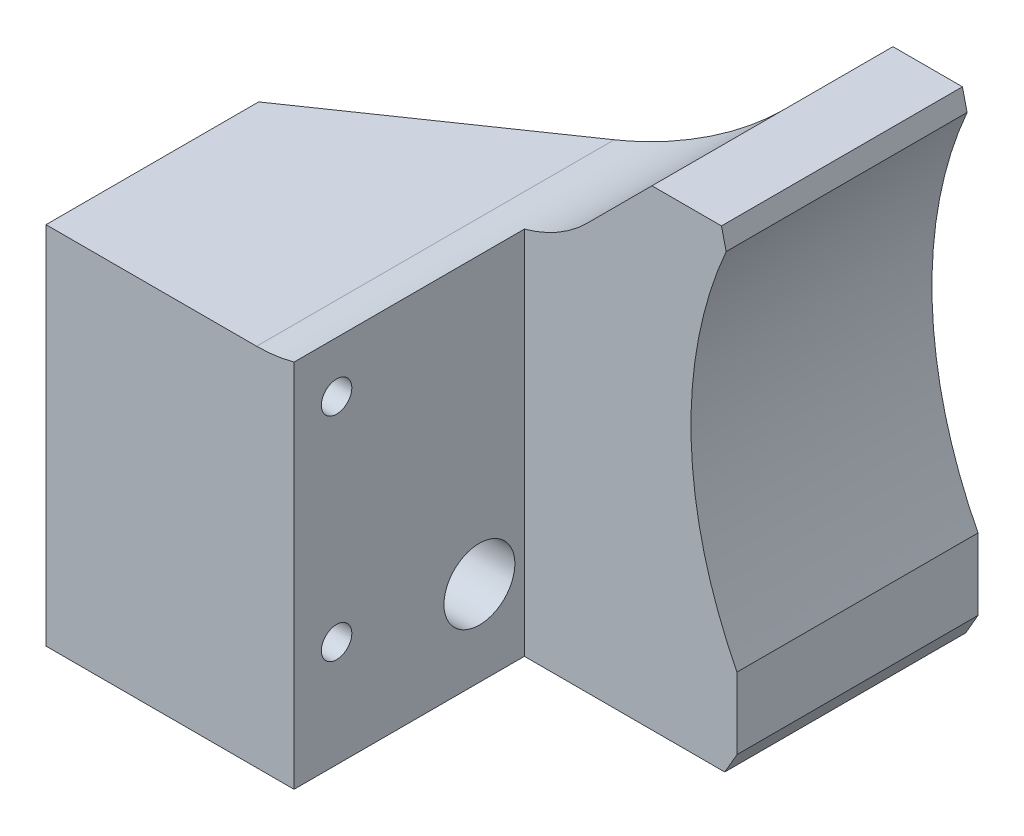
ISO-10303-21;
HEADER;
FILE_DESCRIPTION(('STEP AP214'),'2;1');
FILE_NAME('part.step','',(''),(''),'','','');
FILE_SCHEMA(('AUTOMOTIVE_DESIGN { 1 0 10303 214 1 1 1 1 }'));
ENDSEC;
DATA;
#1=APPLICATION_CONTEXT('core data for automotive mechanical design processes');
#2=APPLICATION_PROTOCOL_DEFINITION('international standard','automotive_design',2000,#1);
#3=PRODUCT_CONTEXT('',#1,'mechanical');
#4=PRODUCT('Part','Part','',(#3));
#5=PRODUCT_RELATED_PRODUCT_CATEGORY('part','',(#4));
#6=PRODUCT_DEFINITION_FORMATION('','',#4);
#7=PRODUCT_DEFINITION_CONTEXT('part definition',#1,'design');
#8=PRODUCT_DEFINITION('design','',#6,#7);
#9=PRODUCT_DEFINITION_SHAPE('','',#8);
#10=(LENGTH_UNIT() NAMED_UNIT(*) SI_UNIT(.MILLI.,.METRE.));
#11=(NAMED_UNIT(*) PLANE_ANGLE_UNIT() SI_UNIT($,.RADIAN.));
#12=(NAMED_UNIT(*) SI_UNIT($,.STERADIAN.) SOLID_ANGLE_UNIT());
#13=UNCERTAINTY_MEASURE_WITH_UNIT(LENGTH_MEASURE(1.E-05),#10,'distance_accuracy_value','');
#14=(GEOMETRIC_REPRESENTATION_CONTEXT(3) GLOBAL_UNCERTAINTY_ASSIGNED_CONTEXT((#13)) GLOBAL_UNIT_ASSIGNED_CONTEXT((#10,
#11,#12)) REPRESENTATION_CONTEXT('',''));
#15=CARTESIAN_POINT('',(0.,0.,0.));
#16=DIRECTION('',(0.,0.,1.));
#17=DIRECTION('',(1.,0.,0.));
#18=AXIS2_PLACEMENT_3D('',#15,#16,#17);
#19=CARTESIAN_POINT('',(65.,45.,-6.));
#20=DIRECTION('',(-1.,0.,0.));
#21=DIRECTION('',(0.,0.,-1.));
#22=AXIS2_PLACEMENT_3D('',#19,#20,#21);
#23=CYLINDRICAL_SURFACE('',#22,2.15);
#24=CARTESIAN_POINT('',(35.,45.,-6.));
#25=DIRECTION('',(1.,0.,0.));
#26=DIRECTION('',(0.,0.,-1.));
#27=AXIS2_PLACEMENT_3D('',#24,#25,#26);
#28=CIRCLE('',#27,2.15);
#29=CARTESIAN_POINT('',(35.,45.,-8.15));
#30=VERTEX_POINT('',#29);
#31=EDGE_CURVE('E170',#30,#30,#28,.T.);
#32=ORIENTED_EDGE('',*,*,#31,.T.);
#33=EDGE_LOOP('',(#32));
#34=FACE_BOUND('',#33,.T.);
#35=CARTESIAN_POINT('',(25.,45.,-6.));
#36=DIRECTION('',(1.,0.,0.));
#37=DIRECTION('',(0.,0.,-1.));
#38=AXIS2_PLACEMENT_3D('',#35,#36,#37);
#39=CIRCLE('',#38,2.15);
#40=CARTESIAN_POINT('',(25.,45.,-8.15));
#41=VERTEX_POINT('',#40);
#42=EDGE_CURVE('E240',#41,#41,#39,.F.);
#43=ORIENTED_EDGE('',*,*,#42,.T.);
#44=EDGE_LOOP('',(#43));
#45=FACE_BOUND('',#44,.T.);
#46=ADVANCED_FACE('F43',(#34,#45),#23,.F.);
#47=CARTESIAN_POINT('',(65.,15.,-6.));
#48=DIRECTION('',(-1.,0.,0.));
#49=DIRECTION('',(0.,0.,-1.));
#50=AXIS2_PLACEMENT_3D('',#47,#48,#49);
#51=CYLINDRICAL_SURFACE('',#50,2.15);
#52=CARTESIAN_POINT('',(35.,15.,-6.));
#53=DIRECTION('',(1.,0.,0.));
#54=DIRECTION('',(0.,0.,-1.));
#55=AXIS2_PLACEMENT_3D('',#52,#53,#54);
#56=CIRCLE('',#55,2.15);
#57=CARTESIAN_POINT('',(35.,15.,-8.15));
#58=VERTEX_POINT('',#57);
#59=EDGE_CURVE('E166',#58,#58,#56,.T.);
#60=ORIENTED_EDGE('',*,*,#59,.T.);
#61=EDGE_LOOP('',(#60));
#62=FACE_BOUND('',#61,.T.);
#63=CARTESIAN_POINT('',(25.,15.,-6.));
#64=DIRECTION('',(1.,0.,0.));
#65=DIRECTION('',(0.,0.,-1.));
#66=AXIS2_PLACEMENT_3D('',#63,#64,#65);
#67=CIRCLE('',#66,2.15);
#68=CARTESIAN_POINT('',(25.,15.,-8.15));
#69=VERTEX_POINT('',#68);
#70=EDGE_CURVE('E242',#69,#69,#67,.F.);
#71=ORIENTED_EDGE('',*,*,#70,.T.);
#72=EDGE_LOOP('',(#71));
#73=FACE_BOUND('',#72,.T.);
#74=ADVANCED_FACE('F318',(#62,#73),#51,.F.);
#75=CARTESIAN_POINT('',(0.,51.5,0.));
#76=DIRECTION('',(0.,-1.,0.));
#77=DIRECTION('',(0.,0.,1.));
#78=AXIS2_PLACEMENT_3D('',#75,#76,#77);
#79=PLANE('',#78);
#80=DIRECTION('',(0.823588256020125,0.,-0.567188138579897));
#81=VECTOR('',#80,1.);
#82=CARTESIAN_POINT('',(53.,51.5,-66.5));
#83=LINE('',#82,#81);
#84=CARTESIAN_POINT('',(0.,51.5,-30.));
#85=VERTEX_POINT('',#84);
#86=CARTESIAN_POINT('',(29.7157287525381,51.5,-50.4646056503328));
#87=VERTEX_POINT('',#86);
#88=EDGE_CURVE('E194',#85,#87,#83,.T.);
#89=ORIENTED_EDGE('',*,*,#88,.F.);
#90=DIRECTION('',(0.,0.,-1.));
#91=VECTOR('',#90,1.);
#92=CARTESIAN_POINT('',(0.,51.5,-30.));
#93=LINE('',#92,#91);
#94=CARTESIAN_POINT('',(0.,51.5,0.));
#95=VERTEX_POINT('',#94);
#96=EDGE_CURVE('E191',#95,#85,#93,.T.);
#97=ORIENTED_EDGE('',*,*,#96,.F.);
#98=DIRECTION('',(-1.,0.,0.));
#99=VECTOR('',#98,1.);
#100=CARTESIAN_POINT('',(0.,51.5,0.));
#101=LINE('',#100,#99);
#102=CARTESIAN_POINT('',(29.7157287525381,51.5,0.));
#103=VERTEX_POINT('',#102);
#104=EDGE_CURVE('E198',#103,#95,#101,.T.);
#105=ORIENTED_EDGE('',*,*,#104,.F.);
#106=DIRECTION('',(0.,0.,-1.));
#107=VECTOR('',#106,1.);
#108=CARTESIAN_POINT('',(29.7157287525381,51.5,-32.5));
#109=LINE('',#108,#107);
#110=EDGE_CURVE('E238',#87,#103,#109,.F.);
#111=ORIENTED_EDGE('',*,*,#110,.F.);
#112=EDGE_LOOP('',(#89,#97,#105,#111));
#113=FACE_BOUND('',#112,.T.);
#114=ADVANCED_FACE('F297',(#113),#79,.F.);
#115=CARTESIAN_POINT('',(0.,51.5,-30.));
#116=DIRECTION('',(1.,0.,0.));
#117=DIRECTION('',(0.,0.,1.));
#118=AXIS2_PLACEMENT_3D('',#115,#116,#117);
#119=PLANE('',#118);
#120=CARTESIAN_POINT('',(0.,45.,-6.));
#121=DIRECTION('',(1.,0.,0.));
#122=DIRECTION('',(0.,0.,-1.));
#123=AXIS2_PLACEMENT_3D('',#120,#121,#122);
#124=CIRCLE('',#123,4.5);
#125=CARTESIAN_POINT('',(0.,45.,-10.5));
#126=VERTEX_POINT('',#125);
#127=EDGE_CURVE('E511',#126,#126,#124,.T.);
#128=ORIENTED_EDGE('',*,*,#127,.T.);
#129=EDGE_LOOP('',(#128));
#130=FACE_BOUND('',#129,.T.);
#131=CARTESIAN_POINT('',(0.,15.,-6.));
#132=DIRECTION('',(1.,0.,0.));
#133=DIRECTION('',(0.,0.,-1.));
#134=AXIS2_PLACEMENT_3D('',#131,#132,#133);
#135=CIRCLE('',#134,4.5);
#136=CARTESIAN_POINT('',(0.,15.,-10.5));
#137=VERTEX_POINT('',#136);
#138=EDGE_CURVE('E515',#137,#137,#135,.T.);
#139=ORIENTED_EDGE('',*,*,#138,.T.);
#140=EDGE_LOOP('',(#139));
#141=FACE_BOUND('',#140,.T.);
#142=DIRECTION('',(0.,-1.,0.));
#143=VECTOR('',#142,1.);
#144=CARTESIAN_POINT('',(0.,51.5,-30.));
#145=LINE('',#144,#143);
#146=CARTESIAN_POINT('',(0.,8.80978057181012,-30.));
#147=VERTEX_POINT('',#146);
#148=CARTESIAN_POINT('',(0.,0.,-30.));
#149=VERTEX_POINT('',#148);
#150=EDGE_CURVE('E228',#147,#149,#145,.T.);
#151=ORIENTED_EDGE('',*,*,#150,.T.);
#152=DIRECTION('',(0.,0.,-1.));
#153=VECTOR('',#152,1.);
#154=CARTESIAN_POINT('',(0.,0.,-30.));
#155=LINE('',#154,#153);
#156=CARTESIAN_POINT('',(0.,0.,0.));
#157=VERTEX_POINT('',#156);
#158=EDGE_CURVE('E190',#157,#149,#155,.T.);
#159=ORIENTED_EDGE('',*,*,#158,.F.);
#160=DIRECTION('',(0.,-1.,0.));
#161=VECTOR('',#160,1.);
#162=CARTESIAN_POINT('',(0.,51.5,0.));
#163=LINE('',#162,#161);
#164=EDGE_CURVE('E201',#95,#157,#163,.T.);
#165=ORIENTED_EDGE('',*,*,#164,.F.);
#166=ORIENTED_EDGE('',*,*,#96,.T.);
#167=CARTESIAN_POINT('',(0.,15.1902194281899,-30.));
#168=VERTEX_POINT('',#167);
#169=EDGE_CURVE('E229',#85,#168,#145,.T.);
#170=ORIENTED_EDGE('',*,*,#169,.T.);
#171=CARTESIAN_POINT('',(0.,12.,-26.15));
#172=DIRECTION('',(-1.,0.,0.));
#173=DIRECTION('',(0.,0.,1.));
#174=AXIS2_PLACEMENT_3D('',#171,#172,#173);
#175=CIRCLE('',#174,5.);
#176=EDGE_CURVE('E183',#147,#168,#175,.T.);
#177=ORIENTED_EDGE('',*,*,#176,.F.);
#178=EDGE_LOOP('',(#151,#159,#165,#166,#170,#177));
#179=FACE_BOUND('',#178,.T.);
#180=ADVANCED_FACE('F340',(#130,#141,#179),#119,.F.);
#181=CARTESIAN_POINT('',(53.,51.5,-66.5));
#182=DIRECTION('',(0.567188138579897,0.,0.823588256020125));
#183=DIRECTION('',(-0.823588256020125,0.,0.567188138579897));
#184=AXIS2_PLACEMENT_3D('',#181,#182,#183);
#185=PLANE('',#184);
#186=ORIENTED_EDGE('',*,*,#169,.F.);
#187=ORIENTED_EDGE('',*,*,#88,.T.);
#188=CARTESIAN_POINT('',(29.7157287525381,71.5,-50.4646056503328));
#189=DIRECTION('',(-0.567188138579897,0.,-0.823588256020125));
#190=DIRECTION('',(-0.823588256020125,0.,0.567188138579897));
#191=AXIS2_PLACEMENT_3D('',#188,#189,#190);
#192=ELLIPSE('',#191,24.2839791046162,20.);
#193=CARTESIAN_POINT('',(43.8578643762691,57.3578643762691,-60.204000938374));
#194=VERTEX_POINT('',#193);
#195=EDGE_CURVE('E259',#194,#87,#192,.T.);
#196=ORIENTED_EDGE('',*,*,#195,.F.);
#197=DIRECTION('',(0.635734318570653,0.63573431857066,-0.437817030713751));
#198=VECTOR('',#197,1.);
#199=CARTESIAN_POINT('',(46.9376281428725,60.4376281428725,-62.3249703248084));
#200=LINE('',#199,#198);
#201=CARTESIAN_POINT('',(53.,66.5000000000001,-66.5));
#202=VERTEX_POINT('',#201);
#203=EDGE_CURVE('E232',#202,#194,#200,.F.);
#204=ORIENTED_EDGE('',*,*,#203,.F.);
#205=DIRECTION('',(0.,-1.,0.));
#206=VECTOR('',#205,1.);
#207=CARTESIAN_POINT('',(53.,51.5,-66.5));
#208=LINE('',#207,#206);
#209=CARTESIAN_POINT('',(53.,0.,-66.5));
#210=VERTEX_POINT('',#209);
#211=EDGE_CURVE('E159',#202,#210,#208,.T.);
#212=ORIENTED_EDGE('',*,*,#211,.T.);
#213=DIRECTION('',(0.823588256020125,0.,-0.567188138579897));
#214=VECTOR('',#213,1.);
#215=CARTESIAN_POINT('',(53.,0.,-66.5));
#216=LINE('',#215,#214);
#217=EDGE_CURVE('E204',#149,#210,#216,.T.);
#218=ORIENTED_EDGE('',*,*,#217,.F.);
#219=ORIENTED_EDGE('',*,*,#150,.F.);
#220=CARTESIAN_POINT('',(-5.59041095890409,12.,-26.15));
#221=DIRECTION('',(-0.567188138579897,0.,-0.823588256020125));
#222=DIRECTION('',(0.823588256020125,0.,-0.567188138579897));
#223=AXIS2_PLACEMENT_3D('',#220,#221,#222);
#224=ELLIPSE('',#223,8.81541707222368,5.);
#225=EDGE_CURVE('E186',#168,#147,#224,.T.);
#226=ORIENTED_EDGE('',*,*,#225,.F.);
#227=EDGE_LOOP('',(#186,#187,#196,#204,#212,#218,#219,#226));
#228=FACE_BOUND('',#227,.T.);
#229=ADVANCED_FACE('F289',(#228),#185,.F.);
#230=CARTESIAN_POINT('',(65.,51.5,-66.5));
#231=DIRECTION('',(0.,0.,1.));
#232=DIRECTION('',(-1.,0.,0.));
#233=AXIS2_PLACEMENT_3D('',#230,#231,#232);
#234=PLANE('',#233);
#235=CARTESIAN_POINT('',(117.5,40.,-66.5));
#236=DIRECTION('',(0.,0.,1.));
#237=DIRECTION('',(1.,0.,0.));
#238=AXIS2_PLACEMENT_3D('',#235,#236,#237);
#239=CIRCLE('',#238,59.);
#240=CARTESIAN_POINT('',(63.4678246627246,63.696498229104,-66.5));
#241=VERTEX_POINT('',#240);
#242=CARTESIAN_POINT('',(65.,13.0788187480564,-66.5));
#243=VERTEX_POINT('',#242);
#244=EDGE_CURVE('E143',#241,#243,#239,.T.);
#245=ORIENTED_EDGE('',*,*,#244,.T.);
#246=DIRECTION('',(0.,-1.,0.));
#247=VECTOR('',#246,1.);
#248=CARTESIAN_POINT('',(65.,51.5,-66.5));
#249=LINE('',#248,#247);
#250=CARTESIAN_POINT('',(65.,3.00000000000003,-66.5));
#251=VERTEX_POINT('',#250);
#252=EDGE_CURVE('E152',#243,#251,#249,.T.);
#253=ORIENTED_EDGE('',*,*,#252,.T.);
#254=DIRECTION('',(0.499999999999992,0.866025403784443,0.));
#255=VECTOR('',#254,1.);
#256=CARTESIAN_POINT('',(65.,3.00000000000002,-66.5));
#257=LINE('',#256,#255);
#258=CARTESIAN_POINT('',(63.2679491924312,0.,-66.5));
#259=VERTEX_POINT('',#258);
#260=EDGE_CURVE('E267',#259,#251,#257,.T.);
#261=ORIENTED_EDGE('',*,*,#260,.F.);
#262=DIRECTION('',(1.,0.,0.));
#263=VECTOR('',#262,1.);
#264=CARTESIAN_POINT('',(65.,0.,-66.5));
#265=LINE('',#264,#263);
#266=EDGE_CURVE('E207',#210,#259,#265,.T.);
#267=ORIENTED_EDGE('',*,*,#266,.F.);
#268=ORIENTED_EDGE('',*,*,#211,.F.);
#269=DIRECTION('',(1.,0.,0.));
#270=VECTOR('',#269,1.);
#271=CARTESIAN_POINT('',(65.,66.5,-66.5));
#272=LINE('',#271,#270);
#273=CARTESIAN_POINT('',(62.8045533800256,66.5,-66.5));
#274=VERTEX_POINT('',#273);
#275=EDGE_CURVE('E180',#202,#274,#272,.T.);
#276=ORIENTED_EDGE('',*,*,#275,.T.);
#277=DIRECTION('',(0.230231050966929,-0.97313599418101,0.));
#278=VECTOR('',#277,1.);
#279=CARTESIAN_POINT('',(63.4678246627246,63.696498229104,-66.5));
#280=LINE('',#279,#278);
#281=EDGE_CURVE('E165',#241,#274,#280,.F.);
#282=ORIENTED_EDGE('',*,*,#281,.F.);
#283=EDGE_LOOP('',(#245,#253,#261,#267,#268,#276,#282));
#284=FACE_BOUND('',#283,.T.);
#285=ADVANCED_FACE('F163',(#284),#234,.F.);
#286=CARTESIAN_POINT('',(65.,51.5,-32.5));
#287=DIRECTION('',(-1.,0.,0.));
#288=DIRECTION('',(0.,0.,-1.));
#289=AXIS2_PLACEMENT_3D('',#286,#287,#288);
#290=PLANE('',#289);
#291=ORIENTED_EDGE('',*,*,#252,.F.);
#292=DIRECTION('',(0.,0.,-1.));
#293=VECTOR('',#292,1.);
#294=CARTESIAN_POINT('',(65.,13.0788187480565,0.));
#295=LINE('',#294,#293);
#296=CARTESIAN_POINT('',(65.,13.0788187480564,-32.5));
#297=VERTEX_POINT('',#296);
#298=EDGE_CURVE('E139',#297,#243,#295,.T.);
#299=ORIENTED_EDGE('',*,*,#298,.F.);
#300=DIRECTION('',(0.,-1.,0.));
#301=VECTOR('',#300,1.);
#302=CARTESIAN_POINT('',(65.,51.5,-32.5));
#303=LINE('',#302,#301);
#304=CARTESIAN_POINT('',(65.,3.00000000000003,-32.5));
#305=VERTEX_POINT('',#304);
#306=EDGE_CURVE('E160',#297,#305,#303,.T.);
#307=ORIENTED_EDGE('',*,*,#306,.T.);
#308=DIRECTION('',(0.,0.,1.));
#309=VECTOR('',#308,1.);
#310=CARTESIAN_POINT('',(65.,3.00000000000003,-32.5));
#311=LINE('',#310,#309);
#312=EDGE_CURVE('E155',#251,#305,#311,.T.);
#313=ORIENTED_EDGE('',*,*,#312,.F.);
#314=EDGE_LOOP('',(#291,#299,#307,#313));
#315=FACE_BOUND('',#314,.T.);
#316=ADVANCED_FACE('F153',(#315),#290,.F.);
#317=CARTESIAN_POINT('',(35.,51.5,-32.5));
#318=DIRECTION('',(0.,0.,-1.));
#319=DIRECTION('',(1.,0.,0.));
#320=AXIS2_PLACEMENT_3D('',#317,#318,#319);
#321=PLANE('',#320);
#322=DIRECTION('',(-1.,0.,0.));
#323=VECTOR('',#322,1.);
#324=CARTESIAN_POINT('',(65.,66.5,-32.5));
#325=LINE('',#324,#323);
#326=CARTESIAN_POINT('',(62.8045533800256,66.5,-32.5));
#327=VERTEX_POINT('',#326);
#328=CARTESIAN_POINT('',(53.,66.5,-32.5));
#329=VERTEX_POINT('',#328);
#330=EDGE_CURVE('E149',#327,#329,#325,.T.);
#331=ORIENTED_EDGE('',*,*,#330,.T.);
#332=DIRECTION('',(-0.707106781186543,-0.707106781186552,0.));
#333=VECTOR('',#332,1.);
#334=CARTESIAN_POINT('',(36.5,50.,-32.5));
#335=LINE('',#334,#333);
#336=CARTESIAN_POINT('',(43.8578643762691,57.3578643762691,-32.5));
#337=VERTEX_POINT('',#336);
#338=EDGE_CURVE('E235',#337,#329,#335,.F.);
#339=ORIENTED_EDGE('',*,*,#338,.F.);
#340=CARTESIAN_POINT('',(29.7157287525381,71.5,-32.5));
#341=DIRECTION('',(0.,0.,1.));
#342=DIRECTION('',(1.,0.,0.));
#343=AXIS2_PLACEMENT_3D('',#340,#341,#342);
#344=CIRCLE('',#343,20.);
#345=CARTESIAN_POINT('',(35.,52.2107159960965,-32.5));
#346=VERTEX_POINT('',#345);
#347=EDGE_CURVE('E256',#346,#337,#344,.T.);
#348=ORIENTED_EDGE('',*,*,#347,.F.);
#349=DIRECTION('',(0.,-1.,0.));
#350=VECTOR('',#349,1.);
#351=CARTESIAN_POINT('',(35.,51.5,-32.5));
#352=LINE('',#351,#350);
#353=CARTESIAN_POINT('',(35.,0.,-32.5));
#354=VERTEX_POINT('',#353);
#355=EDGE_CURVE('E222',#346,#354,#352,.T.);
#356=ORIENTED_EDGE('',*,*,#355,.T.);
#357=DIRECTION('',(-1.,0.,0.));
#358=VECTOR('',#357,1.);
#359=CARTESIAN_POINT('',(35.,0.,-32.5));
#360=LINE('',#359,#358);
#361=CARTESIAN_POINT('',(63.2679491924311,0.,-32.5));
#362=VERTEX_POINT('',#361);
#363=EDGE_CURVE('E210',#362,#354,#360,.T.);
#364=ORIENTED_EDGE('',*,*,#363,.F.);
#365=DIRECTION('',(-0.499999999999992,-0.866025403784443,0.));
#366=VECTOR('',#365,1.);
#367=CARTESIAN_POINT('',(65.,3.00000000000003,-32.5));
#368=LINE('',#367,#366);
#369=EDGE_CURVE('E262',#305,#362,#368,.T.);
#370=ORIENTED_EDGE('',*,*,#369,.F.);
#371=ORIENTED_EDGE('',*,*,#306,.F.);
#372=CARTESIAN_POINT('',(117.5,40.,-32.5));
#373=DIRECTION('',(0.,0.,1.));
#374=DIRECTION('',(1.,0.,0.));
#375=AXIS2_PLACEMENT_3D('',#372,#373,#374);
#376=CIRCLE('',#375,59.);
#377=CARTESIAN_POINT('',(63.4678246627246,63.696498229104,-32.5));
#378=VERTEX_POINT('',#377);
#379=EDGE_CURVE('E145',#378,#297,#376,.T.);
#380=ORIENTED_EDGE('',*,*,#379,.F.);
#381=DIRECTION('',(-0.230231050966929,0.97313599418101,0.));
#382=VECTOR('',#381,1.);
#383=CARTESIAN_POINT('',(63.4678246627246,63.696498229104,-32.5));
#384=LINE('',#383,#382);
#385=EDGE_CURVE('E11',#327,#378,#384,.F.);
#386=ORIENTED_EDGE('',*,*,#385,.F.);
#387=EDGE_LOOP('',(#331,#339,#348,#356,#364,#370,#371,#380,#386));
#388=FACE_BOUND('',#387,.T.);
#389=ADVANCED_FACE('F279',(#388),#321,.F.);
#390=CARTESIAN_POINT('',(35.,51.5,0.));
#391=DIRECTION('',(-1.,0.,0.));
#392=DIRECTION('',(0.,0.,-1.));
#393=AXIS2_PLACEMENT_3D('',#390,#391,#392);
#394=PLANE('',#393);
#395=ORIENTED_EDGE('',*,*,#59,.F.);
#396=EDGE_LOOP('',(#395));
#397=FACE_BOUND('',#396,.T.);
#398=ORIENTED_EDGE('',*,*,#31,.F.);
#399=EDGE_LOOP('',(#398));
#400=FACE_BOUND('',#399,.T.);
#401=CARTESIAN_POINT('',(35.,12.,-26.15));
#402=DIRECTION('',(-1.,0.,0.));
#403=DIRECTION('',(0.,0.,1.));
#404=AXIS2_PLACEMENT_3D('',#401,#402,#403);
#405=CIRCLE('',#404,5.);
#406=CARTESIAN_POINT('',(35.,12.,-21.15));
#407=VERTEX_POINT('',#406);
#408=EDGE_CURVE('E182',#407,#407,#405,.T.);
#409=ORIENTED_EDGE('',*,*,#408,.T.);
#410=EDGE_LOOP('',(#409));
#411=FACE_BOUND('',#410,.T.);
#412=DIRECTION('',(0.,0.,1.));
#413=VECTOR('',#412,1.);
#414=CARTESIAN_POINT('',(35.,0.,0.));
#415=LINE('',#414,#413);
#416=CARTESIAN_POINT('',(35.,0.,0.));
#417=VERTEX_POINT('',#416);
#418=EDGE_CURVE('E213',#354,#417,#415,.T.);
#419=ORIENTED_EDGE('',*,*,#418,.F.);
#420=ORIENTED_EDGE('',*,*,#355,.F.);
#421=DIRECTION('',(0.,0.,1.));
#422=VECTOR('',#421,1.);
#423=CARTESIAN_POINT('',(35.,52.2107159960965,0.));
#424=LINE('',#423,#422);
#425=CARTESIAN_POINT('',(35.,52.2107159960965,0.));
#426=VERTEX_POINT('',#425);
#427=EDGE_CURVE('E254',#426,#346,#424,.F.);
#428=ORIENTED_EDGE('',*,*,#427,.F.);
#429=DIRECTION('',(0.,-1.,0.));
#430=VECTOR('',#429,1.);
#431=CARTESIAN_POINT('',(35.,51.5,0.));
#432=LINE('',#431,#430);
#433=EDGE_CURVE('E219',#426,#417,#432,.T.);
#434=ORIENTED_EDGE('',*,*,#433,.T.);
#435=EDGE_LOOP('',(#419,#420,#428,#434));
#436=FACE_BOUND('',#435,.T.);
#437=ADVANCED_FACE('F305',(#397,#400,#411,#436),#394,.F.);
#438=CARTESIAN_POINT('',(0.,51.5,0.));
#439=DIRECTION('',(0.,0.,-1.));
#440=DIRECTION('',(1.,0.,0.));
#441=AXIS2_PLACEMENT_3D('',#438,#439,#440);
#442=PLANE('',#441);
#443=DIRECTION('',(-1.,0.,0.));
#444=VECTOR('',#443,1.);
#445=CARTESIAN_POINT('',(0.,0.,0.));
#446=LINE('',#445,#444);
#447=EDGE_CURVE('E195',#417,#157,#446,.T.);
#448=ORIENTED_EDGE('',*,*,#447,.F.);
#449=ORIENTED_EDGE('',*,*,#433,.F.);
#450=CARTESIAN_POINT('',(29.7157287525381,71.5,0.));
#451=DIRECTION('',(0.,0.,1.));
#452=DIRECTION('',(1.,0.,0.));
#453=AXIS2_PLACEMENT_3D('',#450,#451,#452);
#454=CIRCLE('',#453,20.);
#455=EDGE_CURVE('E252',#103,#426,#454,.T.);
#456=ORIENTED_EDGE('',*,*,#455,.F.);
#457=ORIENTED_EDGE('',*,*,#104,.T.);
#458=ORIENTED_EDGE('',*,*,#164,.T.);
#459=EDGE_LOOP('',(#448,#449,#456,#457,#458));
#460=FACE_BOUND('',#459,.T.);
#461=ADVANCED_FACE('F300',(#460),#442,.F.);
#462=CARTESIAN_POINT('',(0.,0.,0.));
#463=DIRECTION('',(0.,-1.,0.));
#464=DIRECTION('',(0.,0.,1.));
#465=AXIS2_PLACEMENT_3D('',#462,#463,#464);
#466=PLANE('',#465);
#467=ORIENTED_EDGE('',*,*,#363,.T.);
#468=ORIENTED_EDGE('',*,*,#418,.T.);
#469=ORIENTED_EDGE('',*,*,#447,.T.);
#470=ORIENTED_EDGE('',*,*,#158,.T.);
#471=ORIENTED_EDGE('',*,*,#217,.T.);
#472=ORIENTED_EDGE('',*,*,#266,.T.);
#473=DIRECTION('',(0.,0.,-1.));
#474=VECTOR('',#473,1.);
#475=CARTESIAN_POINT('',(63.2679491924312,0.,-66.5));
#476=LINE('',#475,#474);
#477=EDGE_CURVE('E265',#362,#259,#476,.T.);
#478=ORIENTED_EDGE('',*,*,#477,.F.);
#479=EDGE_LOOP('',(#467,#468,#469,#470,#471,#472,#478));
#480=FACE_BOUND('',#479,.T.);
#481=ADVANCED_FACE('F284',(#480),#466,.T.);
#482=CARTESIAN_POINT('',(0.,12.,-26.15));
#483=DIRECTION('',(1.,0.,0.));
#484=DIRECTION('',(0.,0.,1.));
#485=AXIS2_PLACEMENT_3D('',#482,#483,#484);
#486=CYLINDRICAL_SURFACE('',#485,5.);
#487=ORIENTED_EDGE('',*,*,#408,.F.);
#488=EDGE_LOOP('',(#487));
#489=FACE_BOUND('',#488,.T.);
#490=ORIENTED_EDGE('',*,*,#176,.T.);
#491=ORIENTED_EDGE('',*,*,#225,.T.);
#492=EDGE_LOOP('',(#490,#491));
#493=FACE_BOUND('',#492,.T.);
#494=ADVANCED_FACE('F334',(#489,#493),#486,.F.);
#495=CARTESIAN_POINT('',(0.,66.5,0.));
#496=DIRECTION('',(0.,1.,0.));
#497=DIRECTION('',(0.,0.,-1.));
#498=AXIS2_PLACEMENT_3D('',#495,#496,#497);
#499=PLANE('',#498);
#500=ORIENTED_EDGE('',*,*,#275,.F.);
#501=DIRECTION('',(0.,0.,-1.));
#502=VECTOR('',#501,1.);
#503=CARTESIAN_POINT('',(53.,66.5,-66.5));
#504=LINE('',#503,#502);
#505=EDGE_CURVE('E178',#329,#202,#504,.T.);
#506=ORIENTED_EDGE('',*,*,#505,.F.);
#507=ORIENTED_EDGE('',*,*,#330,.F.);
#508=DIRECTION('',(0.,0.,1.));
#509=VECTOR('',#508,1.);
#510=CARTESIAN_POINT('',(62.8045533800256,66.5,-32.5));
#511=LINE('',#510,#509);
#512=EDGE_CURVE('E51',#274,#327,#511,.T.);
#513=ORIENTED_EDGE('',*,*,#512,.F.);
#514=EDGE_LOOP('',(#500,#506,#507,#513));
#515=FACE_BOUND('',#514,.T.);
#516=ADVANCED_FACE('F273',(#515),#499,.T.);
#517=CARTESIAN_POINT('',(53.,66.5000000000001,-66.5));
#518=DIRECTION('',(-0.707106781186552,0.707106781186543,0.));
#519=DIRECTION('',(0.,0.,1.));
#520=AXIS2_PLACEMENT_3D('',#517,#518,#519);
#521=PLANE('',#520);
#522=ORIENTED_EDGE('',*,*,#338,.T.);
#523=ORIENTED_EDGE('',*,*,#505,.T.);
#524=ORIENTED_EDGE('',*,*,#203,.T.);
#525=DIRECTION('',(0.,0.,1.));
#526=VECTOR('',#525,1.);
#527=CARTESIAN_POINT('',(43.8578643762691,57.3578643762691,-56.1698113207548));
#528=LINE('',#527,#526);
#529=EDGE_CURVE('E250',#337,#194,#528,.F.);
#530=ORIENTED_EDGE('',*,*,#529,.F.);
#531=EDGE_LOOP('',(#522,#523,#524,#530));
#532=FACE_BOUND('',#531,.T.);
#533=ADVANCED_FACE('F276',(#532),#521,.T.);
#534=CARTESIAN_POINT('',(117.5,40.,0.));
#535=DIRECTION('',(0.,0.,-1.));
#536=DIRECTION('',(1.,0.,0.));
#537=AXIS2_PLACEMENT_3D('',#534,#535,#536);
#538=CYLINDRICAL_SURFACE('',#537,59.);
#539=ORIENTED_EDGE('',*,*,#379,.T.);
#540=ORIENTED_EDGE('',*,*,#298,.T.);
#541=ORIENTED_EDGE('',*,*,#244,.F.);
#542=DIRECTION('',(0.,0.,-1.));
#543=VECTOR('',#542,1.);
#544=CARTESIAN_POINT('',(63.4678246627246,63.696498229104,0.));
#545=LINE('',#544,#543);
#546=EDGE_CURVE('E269',#378,#241,#545,.T.);
#547=ORIENTED_EDGE('',*,*,#546,.F.);
#548=EDGE_LOOP('',(#539,#540,#541,#547));
#549=FACE_BOUND('',#548,.T.);
#550=ADVANCED_FACE('F141',(#549),#538,.F.);
#551=CARTESIAN_POINT('',(25.,15.,-6.));
#552=DIRECTION('',(-1.,0.,0.));
#553=DIRECTION('',(0.,0.,-1.));
#554=AXIS2_PLACEMENT_3D('',#551,#552,#553);
#555=PLANE('',#554);
#556=CARTESIAN_POINT('',(25.,15.,-6.));
#557=DIRECTION('',(1.,0.,0.));
#558=DIRECTION('',(0.,0.,-1.));
#559=AXIS2_PLACEMENT_3D('',#556,#557,#558);
#560=CIRCLE('',#559,4.5);
#561=CARTESIAN_POINT('',(25.,15.,-10.5));
#562=VERTEX_POINT('',#561);
#563=EDGE_CURVE('E173',#562,#562,#560,.T.);
#564=ORIENTED_EDGE('',*,*,#563,.F.);
#565=EDGE_LOOP('',(#564));
#566=FACE_BOUND('',#565,.T.);
#567=ORIENTED_EDGE('',*,*,#70,.F.);
#568=EDGE_LOOP('',(#567));
#569=FACE_BOUND('',#568,.T.);
#570=ADVANCED_FACE('F331',(#566,#569),#555,.T.);
#571=CARTESIAN_POINT('',(25.,15.,-6.));
#572=DIRECTION('',(-1.,0.,0.));
#573=DIRECTION('',(0.,0.,-1.));
#574=AXIS2_PLACEMENT_3D('',#571,#572,#573);
#575=CYLINDRICAL_SURFACE('',#574,4.5);
#576=ORIENTED_EDGE('',*,*,#563,.T.);
#577=EDGE_LOOP('',(#576));
#578=FACE_BOUND('',#577,.T.);
#579=ORIENTED_EDGE('',*,*,#138,.F.);
#580=EDGE_LOOP('',(#579));
#581=FACE_BOUND('',#580,.T.);
#582=ADVANCED_FACE('F375',(#578,#581),#575,.F.);
#583=CARTESIAN_POINT('',(25.,45.,-6.));
#584=DIRECTION('',(-1.,0.,0.));
#585=DIRECTION('',(0.,0.,-1.));
#586=AXIS2_PLACEMENT_3D('',#583,#584,#585);
#587=PLANE('',#586);
#588=CARTESIAN_POINT('',(25.,45.,-6.));
#589=DIRECTION('',(1.,0.,0.));
#590=DIRECTION('',(0.,0.,-1.));
#591=AXIS2_PLACEMENT_3D('',#588,#589,#590);
#592=CIRCLE('',#591,4.5);
#593=CARTESIAN_POINT('',(25.,45.,-10.5));
#594=VERTEX_POINT('',#593);
#595=EDGE_CURVE('E245',#594,#594,#592,.T.);
#596=ORIENTED_EDGE('',*,*,#595,.F.);
#597=EDGE_LOOP('',(#596));
#598=FACE_BOUND('',#597,.T.);
#599=ORIENTED_EDGE('',*,*,#42,.F.);
#600=EDGE_LOOP('',(#599));
#601=FACE_BOUND('',#600,.T.);
#602=ADVANCED_FACE('F383',(#598,#601),#587,.T.);
#603=CARTESIAN_POINT('',(25.,45.,-6.));
#604=DIRECTION('',(-1.,0.,0.));
#605=DIRECTION('',(0.,0.,-1.));
#606=AXIS2_PLACEMENT_3D('',#603,#604,#605);
#607=CYLINDRICAL_SURFACE('',#606,4.5);
#608=ORIENTED_EDGE('',*,*,#595,.T.);
#609=EDGE_LOOP('',(#608));
#610=FACE_BOUND('',#609,.T.);
#611=ORIENTED_EDGE('',*,*,#127,.F.);
#612=EDGE_LOOP('',(#611));
#613=FACE_BOUND('',#612,.T.);
#614=ADVANCED_FACE('F392',(#610,#613),#607,.F.);
#615=CARTESIAN_POINT('',(29.7157287525381,71.5,0.));
#616=DIRECTION('',(0.,0.,1.));
#617=DIRECTION('',(-1.,0.,0.));
#618=AXIS2_PLACEMENT_3D('',#615,#616,#617);
#619=CYLINDRICAL_SURFACE('',#618,20.);
#620=ORIENTED_EDGE('',*,*,#195,.T.);
#621=ORIENTED_EDGE('',*,*,#110,.T.);
#622=ORIENTED_EDGE('',*,*,#455,.T.);
#623=ORIENTED_EDGE('',*,*,#427,.T.);
#624=ORIENTED_EDGE('',*,*,#347,.T.);
#625=ORIENTED_EDGE('',*,*,#529,.T.);
#626=EDGE_LOOP('',(#620,#621,#622,#623,#624,#625));
#627=FACE_BOUND('',#626,.T.);
#628=ADVANCED_FACE('F294',(#627),#619,.F.);
#629=CARTESIAN_POINT('',(65.,3.00000000000003,-32.5));
#630=DIRECTION('',(0.866025403784443,-0.499999999999992,0.));
#631=DIRECTION('',(0.,0.,-1.));
#632=AXIS2_PLACEMENT_3D('',#629,#630,#631);
#633=PLANE('',#632);
#634=ORIENTED_EDGE('',*,*,#260,.T.);
#635=ORIENTED_EDGE('',*,*,#312,.T.);
#636=ORIENTED_EDGE('',*,*,#369,.T.);
#637=ORIENTED_EDGE('',*,*,#477,.T.);
#638=EDGE_LOOP('',(#634,#635,#636,#637));
#639=FACE_BOUND('',#638,.T.);
#640=ADVANCED_FACE('F282',(#639),#633,.T.);
#641=CARTESIAN_POINT('',(63.4678246627246,63.696498229104,0.));
#642=DIRECTION('',(-0.97313599418101,-0.230231050966929,0.));
#643=DIRECTION('',(0.,0.,-1.));
#644=AXIS2_PLACEMENT_3D('',#641,#642,#643);
#645=PLANE('',#644);
#646=ORIENTED_EDGE('',*,*,#385,.T.);
#647=ORIENTED_EDGE('',*,*,#546,.T.);
#648=ORIENTED_EDGE('',*,*,#281,.T.);
#649=ORIENTED_EDGE('',*,*,#512,.T.);
#650=EDGE_LOOP('',(#646,#647,#648,#649));
#651=FACE_BOUND('',#650,.T.);
#652=ADVANCED_FACE('F45',(#651),#645,.F.);
#653=CLOSED_SHELL('',(#46,#74,#114,#180,#229,#285,#316,#389,#437,#461,#481,#494,#516,#533,#550,
#570,#582,#602,#614,#628,#640,#652));
#654=MANIFOLD_SOLID_BREP('B2',#653);
#655=ADVANCED_BREP_SHAPE_REPRESENTATION('',(#18,#654),#14);
#656=SHAPE_DEFINITION_REPRESENTATION(#9,#655);
ENDSEC;
END-ISO-10303-21;
